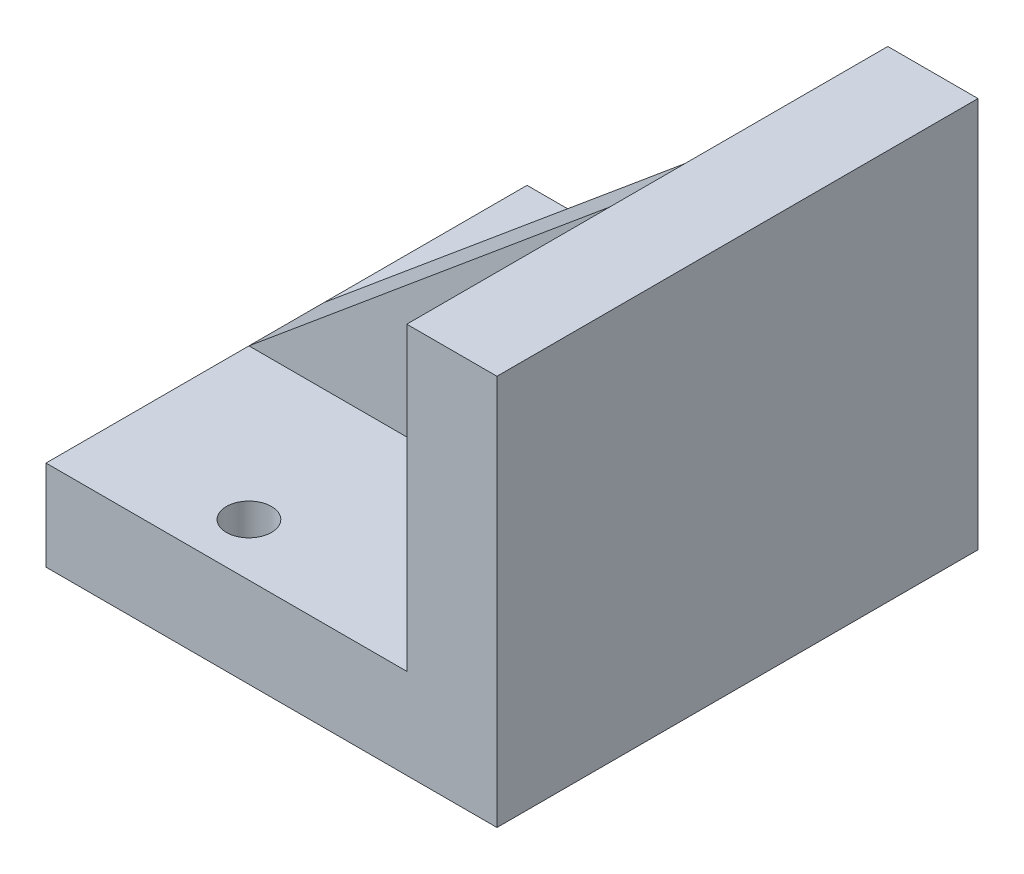
ISO-10303-21;
HEADER;
FILE_DESCRIPTION(('STEP AP214'),'2;1');
FILE_NAME('part.step','',(''),(''),'','','');
FILE_SCHEMA(('AUTOMOTIVE_DESIGN { 1 0 10303 214 1 1 1 1 }'));
ENDSEC;
DATA;
#1=APPLICATION_CONTEXT('core data for automotive mechanical design processes');
#2=APPLICATION_PROTOCOL_DEFINITION('international standard','automotive_design',2000,#1);
#3=PRODUCT_CONTEXT('',#1,'mechanical');
#4=PRODUCT('Part','Part','',(#3));
#5=PRODUCT_RELATED_PRODUCT_CATEGORY('part','',(#4));
#6=PRODUCT_DEFINITION_FORMATION('','',#4);
#7=PRODUCT_DEFINITION_CONTEXT('part definition',#1,'design');
#8=PRODUCT_DEFINITION('design','',#6,#7);
#9=PRODUCT_DEFINITION_SHAPE('','',#8);
#10=(LENGTH_UNIT() NAMED_UNIT(*) SI_UNIT(.MILLI.,.METRE.));
#11=(NAMED_UNIT(*) PLANE_ANGLE_UNIT() SI_UNIT($,.RADIAN.));
#12=(NAMED_UNIT(*) SI_UNIT($,.STERADIAN.) SOLID_ANGLE_UNIT());
#13=UNCERTAINTY_MEASURE_WITH_UNIT(LENGTH_MEASURE(1.E-05),#10,'distance_accuracy_value','');
#14=(GEOMETRIC_REPRESENTATION_CONTEXT(3) GLOBAL_UNCERTAINTY_ASSIGNED_CONTEXT((#13)) GLOBAL_UNIT_ASSIGNED_CONTEXT((#10,
#11,#12)) REPRESENTATION_CONTEXT('',''));
#15=CARTESIAN_POINT('',(0.,0.,0.));
#16=DIRECTION('',(0.,0.,1.));
#17=DIRECTION('',(1.,0.,0.));
#18=AXIS2_PLACEMENT_3D('',#15,#16,#17);
#19=CARTESIAN_POINT('',(0.,6.,0.));
#20=DIRECTION('',(0.,-1.,0.));
#21=DIRECTION('',(0.,0.,-1.));
#22=AXIS2_PLACEMENT_3D('',#19,#20,#21);
#23=PLANE('',#22);
#24=CARTESIAN_POINT('',(-5.00000000000001,6.,-12.5));
#25=DIRECTION('',(0.,1.,0.));
#26=DIRECTION('',(0.,0.,1.));
#27=AXIS2_PLACEMENT_3D('',#24,#25,#26);
#28=CIRCLE('',#27,1.5);
#29=CARTESIAN_POINT('',(-5.00000000000001,6.,-11.));
#30=VERTEX_POINT('',#29);
#31=EDGE_CURVE('E173',#30,#30,#28,.T.);
#32=ORIENTED_EDGE('',*,*,#31,.F.);
#33=EDGE_LOOP('',(#32));
#34=FACE_BOUND('',#33,.T.);
#35=DIRECTION('',(-1.,0.,0.));
#36=VECTOR('',#35,1.);
#37=CARTESIAN_POINT('',(-15.,6.,-2.5));
#38=LINE('',#37,#36);
#39=CARTESIAN_POINT('',(9.,6.,-2.5));
#40=VERTEX_POINT('',#39);
#41=CARTESIAN_POINT('',(-15.,6.,-2.5));
#42=VERTEX_POINT('',#41);
#43=EDGE_CURVE('E201',#40,#42,#38,.T.);
#44=ORIENTED_EDGE('',*,*,#43,.F.);
#45=DIRECTION('',(0.,0.,1.));
#46=VECTOR('',#45,1.);
#47=CARTESIAN_POINT('',(9.,6.,-16.));
#48=LINE('',#47,#46);
#49=CARTESIAN_POINT('',(9.,6.,-16.));
#50=VERTEX_POINT('',#49);
#51=EDGE_CURVE('E50',#50,#40,#48,.T.);
#52=ORIENTED_EDGE('',*,*,#51,.F.);
#53=DIRECTION('',(-1.,0.,0.));
#54=VECTOR('',#53,1.);
#55=CARTESIAN_POINT('',(-15.,6.,-16.));
#56=LINE('',#55,#54);
#57=CARTESIAN_POINT('',(-15.,6.,-16.));
#58=VERTEX_POINT('',#57);
#59=EDGE_CURVE('E90',#50,#58,#56,.T.);
#60=ORIENTED_EDGE('',*,*,#59,.T.);
#61=DIRECTION('',(0.,0.,1.));
#62=VECTOR('',#61,1.);
#63=CARTESIAN_POINT('',(-15.,6.,16.));
#64=LINE('',#63,#62);
#65=EDGE_CURVE('E121',#58,#42,#64,.T.);
#66=ORIENTED_EDGE('',*,*,#65,.T.);
#67=EDGE_LOOP('',(#44,#52,#60,#66));
#68=FACE_BOUND('',#67,.T.);
#69=ADVANCED_FACE('F35',(#34,#68),#23,.F.);
#70=CARTESIAN_POINT('',(-5.,6.,12.5));
#71=DIRECTION('',(0.,1.,0.));
#72=DIRECTION('',(0.,0.,-1.));
#73=AXIS2_PLACEMENT_3D('',#70,#71,#72);
#74=CIRCLE('',#73,1.5);
#75=CARTESIAN_POINT('',(-5.,6.,11.));
#76=VERTEX_POINT('',#75);
#77=EDGE_CURVE('E186',#76,#76,#74,.T.);
#78=ORIENTED_EDGE('',*,*,#77,.F.);
#79=EDGE_LOOP('',(#78));
#80=FACE_BOUND('',#79,.T.);
#81=DIRECTION('',(1.,0.,0.));
#82=VECTOR('',#81,1.);
#83=CARTESIAN_POINT('',(-15.,6.,2.5));
#84=LINE('',#83,#82);
#85=CARTESIAN_POINT('',(-15.,6.,2.5));
#86=VERTEX_POINT('',#85);
#87=CARTESIAN_POINT('',(9.,6.,2.5));
#88=VERTEX_POINT('',#87);
#89=EDGE_CURVE('E170',#86,#88,#84,.T.);
#90=ORIENTED_EDGE('',*,*,#89,.F.);
#91=CARTESIAN_POINT('',(-15.,6.,16.));
#92=VERTEX_POINT('',#91);
#93=EDGE_CURVE('E59',#86,#92,#64,.T.);
#94=ORIENTED_EDGE('',*,*,#93,.T.);
#95=DIRECTION('',(1.,0.,0.));
#96=VECTOR('',#95,1.);
#97=CARTESIAN_POINT('',(-15.,6.,16.));
#98=LINE('',#97,#96);
#99=CARTESIAN_POINT('',(9.,6.,16.));
#100=VERTEX_POINT('',#99);
#101=EDGE_CURVE('E100',#92,#100,#98,.T.);
#102=ORIENTED_EDGE('',*,*,#101,.T.);
#103=EDGE_CURVE('E160',#88,#100,#48,.T.);
#104=ORIENTED_EDGE('',*,*,#103,.F.);
#105=EDGE_LOOP('',(#90,#94,#102,#104));
#106=FACE_BOUND('',#105,.T.);
#107=ADVANCED_FACE('F167',(#80,#106),#23,.F.);
#108=CARTESIAN_POINT('',(9.,26.,-16.));
#109=DIRECTION('',(1.,0.,0.));
#110=DIRECTION('',(0.,0.,-1.));
#111=AXIS2_PLACEMENT_3D('',#108,#109,#110);
#112=PLANE('',#111);
#113=DIRECTION('',(0.,-1.,0.));
#114=VECTOR('',#113,1.);
#115=CARTESIAN_POINT('',(9.,26.,-2.5));
#116=LINE('',#115,#114);
#117=CARTESIAN_POINT('',(9.,26.,-2.5));
#118=VERTEX_POINT('',#117);
#119=EDGE_CURVE('E181',#118,#40,#116,.T.);
#120=ORIENTED_EDGE('',*,*,#119,.F.);
#121=DIRECTION('',(0.,0.,1.));
#122=VECTOR('',#121,1.);
#123=CARTESIAN_POINT('',(9.,26.,-16.));
#124=LINE('',#123,#122);
#125=CARTESIAN_POINT('',(9.,26.,-16.));
#126=VERTEX_POINT('',#125);
#127=EDGE_CURVE('E155',#126,#118,#124,.T.);
#128=ORIENTED_EDGE('',*,*,#127,.F.);
#129=DIRECTION('',(0.,-1.,0.));
#130=VECTOR('',#129,1.);
#131=CARTESIAN_POINT('',(9.,26.,-16.));
#132=LINE('',#131,#130);
#133=EDGE_CURVE('E104',#126,#50,#132,.T.);
#134=ORIENTED_EDGE('',*,*,#133,.T.);
#135=ORIENTED_EDGE('',*,*,#51,.T.);
#136=EDGE_LOOP('',(#120,#128,#134,#135));
#137=FACE_BOUND('',#136,.T.);
#138=ADVANCED_FACE('F193',(#137),#112,.F.);
#139=DIRECTION('',(0.,-1.,0.));
#140=VECTOR('',#139,1.);
#141=CARTESIAN_POINT('',(9.,26.,2.5));
#142=LINE('',#141,#140);
#143=CARTESIAN_POINT('',(9.,26.,2.5));
#144=VERTEX_POINT('',#143);
#145=EDGE_CURVE('E200',#144,#88,#142,.T.);
#146=ORIENTED_EDGE('',*,*,#145,.T.);
#147=ORIENTED_EDGE('',*,*,#103,.T.);
#148=DIRECTION('',(0.,-1.,0.));
#149=VECTOR('',#148,1.);
#150=CARTESIAN_POINT('',(9.,26.,16.));
#151=LINE('',#150,#149);
#152=CARTESIAN_POINT('',(9.,26.,16.));
#153=VERTEX_POINT('',#152);
#154=EDGE_CURVE('E108',#153,#100,#151,.T.);
#155=ORIENTED_EDGE('',*,*,#154,.F.);
#156=EDGE_CURVE('E144',#144,#153,#124,.T.);
#157=ORIENTED_EDGE('',*,*,#156,.F.);
#158=EDGE_LOOP('',(#146,#147,#155,#157));
#159=FACE_BOUND('',#158,.T.);
#160=ADVANCED_FACE('F158',(#159),#112,.F.);
#161=CARTESIAN_POINT('',(15.,6.,16.));
#162=DIRECTION('',(-1.,0.,0.));
#163=DIRECTION('',(0.,0.,1.));
#164=AXIS2_PLACEMENT_3D('',#161,#162,#163);
#165=PLANE('',#164);
#166=DIRECTION('',(0.,0.,-1.));
#167=VECTOR('',#166,1.);
#168=CARTESIAN_POINT('',(15.,0.,16.));
#169=LINE('',#168,#167);
#170=CARTESIAN_POINT('',(15.,0.,16.));
#171=VERTEX_POINT('',#170);
#172=CARTESIAN_POINT('',(15.,0.,-16.));
#173=VERTEX_POINT('',#172);
#174=EDGE_CURVE('E97',#171,#173,#169,.T.);
#175=ORIENTED_EDGE('',*,*,#174,.T.);
#176=DIRECTION('',(0.,-1.,0.));
#177=VECTOR('',#176,1.);
#178=CARTESIAN_POINT('',(15.,6.,-16.));
#179=LINE('',#178,#177);
#180=CARTESIAN_POINT('',(15.,26.,-16.));
#181=VERTEX_POINT('',#180);
#182=EDGE_CURVE('E11',#181,#173,#179,.T.);
#183=ORIENTED_EDGE('',*,*,#182,.F.);
#184=DIRECTION('',(0.,0.,-1.));
#185=VECTOR('',#184,1.);
#186=CARTESIAN_POINT('',(15.,26.,-16.));
#187=LINE('',#186,#185);
#188=CARTESIAN_POINT('',(15.,26.,16.));
#189=VERTEX_POINT('',#188);
#190=EDGE_CURVE('E99',#189,#181,#187,.T.);
#191=ORIENTED_EDGE('',*,*,#190,.F.);
#192=DIRECTION('',(0.,-1.,0.));
#193=VECTOR('',#192,1.);
#194=CARTESIAN_POINT('',(15.,6.,16.));
#195=LINE('',#194,#193);
#196=EDGE_CURVE('E83',#189,#171,#195,.T.);
#197=ORIENTED_EDGE('',*,*,#196,.T.);
#198=EDGE_LOOP('',(#175,#183,#191,#197));
#199=FACE_BOUND('',#198,.T.);
#200=ADVANCED_FACE('F37',(#199),#165,.F.);
#201=CARTESIAN_POINT('',(-15.,6.,-16.));
#202=DIRECTION('',(0.,0.,1.));
#203=DIRECTION('',(1.,0.,0.));
#204=AXIS2_PLACEMENT_3D('',#201,#202,#203);
#205=PLANE('',#204);
#206=DIRECTION('',(-1.,0.,0.));
#207=VECTOR('',#206,1.);
#208=CARTESIAN_POINT('',(-15.,0.,-16.));
#209=LINE('',#208,#207);
#210=CARTESIAN_POINT('',(-15.,0.,-16.));
#211=VERTEX_POINT('',#210);
#212=EDGE_CURVE('E103',#173,#211,#209,.T.);
#213=ORIENTED_EDGE('',*,*,#212,.T.);
#214=DIRECTION('',(0.,-1.,0.));
#215=VECTOR('',#214,1.);
#216=CARTESIAN_POINT('',(-15.,6.,-16.));
#217=LINE('',#216,#215);
#218=EDGE_CURVE('E43',#58,#211,#217,.T.);
#219=ORIENTED_EDGE('',*,*,#218,.F.);
#220=ORIENTED_EDGE('',*,*,#59,.F.);
#221=ORIENTED_EDGE('',*,*,#133,.F.);
#222=DIRECTION('',(-1.,0.,0.));
#223=VECTOR('',#222,1.);
#224=CARTESIAN_POINT('',(15.,26.,-16.));
#225=LINE('',#224,#223);
#226=EDGE_CURVE('E128',#181,#126,#225,.T.);
#227=ORIENTED_EDGE('',*,*,#226,.F.);
#228=ORIENTED_EDGE('',*,*,#182,.T.);
#229=EDGE_LOOP('',(#213,#219,#220,#221,#227,#228));
#230=FACE_BOUND('',#229,.T.);
#231=ADVANCED_FACE('F123',(#230),#205,.F.);
#232=CARTESIAN_POINT('',(-15.,6.,16.));
#233=DIRECTION('',(1.,0.,0.));
#234=DIRECTION('',(0.,0.,-1.));
#235=AXIS2_PLACEMENT_3D('',#232,#233,#234);
#236=PLANE('',#235);
#237=ORIENTED_EDGE('',*,*,#93,.F.);
#238=DIRECTION('',(0.,0.,1.));
#239=VECTOR('',#238,1.);
#240=CARTESIAN_POINT('',(-15.,6.,-16.));
#241=LINE('',#240,#239);
#242=EDGE_CURVE('E207',#42,#86,#241,.T.);
#243=ORIENTED_EDGE('',*,*,#242,.F.);
#244=ORIENTED_EDGE('',*,*,#65,.F.);
#245=ORIENTED_EDGE('',*,*,#218,.T.);
#246=DIRECTION('',(0.,0.,1.));
#247=VECTOR('',#246,1.);
#248=CARTESIAN_POINT('',(-15.,0.,16.));
#249=LINE('',#248,#247);
#250=CARTESIAN_POINT('',(-15.,0.,16.));
#251=VERTEX_POINT('',#250);
#252=EDGE_CURVE('E91',#211,#251,#249,.T.);
#253=ORIENTED_EDGE('',*,*,#252,.T.);
#254=DIRECTION('',(0.,-1.,0.));
#255=VECTOR('',#254,1.);
#256=CARTESIAN_POINT('',(-15.,6.,16.));
#257=LINE('',#256,#255);
#258=EDGE_CURVE('E86',#92,#251,#257,.T.);
#259=ORIENTED_EDGE('',*,*,#258,.F.);
#260=EDGE_LOOP('',(#237,#243,#244,#245,#253,#259));
#261=FACE_BOUND('',#260,.T.);
#262=ADVANCED_FACE('F118',(#261),#236,.F.);
#263=CARTESIAN_POINT('',(-15.,6.,16.));
#264=DIRECTION('',(0.,0.,-1.));
#265=DIRECTION('',(-1.,0.,0.));
#266=AXIS2_PLACEMENT_3D('',#263,#264,#265);
#267=PLANE('',#266);
#268=DIRECTION('',(1.,0.,0.));
#269=VECTOR('',#268,1.);
#270=CARTESIAN_POINT('',(-15.,0.,16.));
#271=LINE('',#270,#269);
#272=EDGE_CURVE('E79',#251,#171,#271,.T.);
#273=ORIENTED_EDGE('',*,*,#272,.T.);
#274=ORIENTED_EDGE('',*,*,#196,.F.);
#275=DIRECTION('',(1.,0.,0.));
#276=VECTOR('',#275,1.);
#277=CARTESIAN_POINT('',(15.,26.,16.));
#278=LINE('',#277,#276);
#279=EDGE_CURVE('E148',#153,#189,#278,.T.);
#280=ORIENTED_EDGE('',*,*,#279,.F.);
#281=ORIENTED_EDGE('',*,*,#154,.T.);
#282=ORIENTED_EDGE('',*,*,#101,.F.);
#283=ORIENTED_EDGE('',*,*,#258,.T.);
#284=EDGE_LOOP('',(#273,#274,#280,#281,#282,#283));
#285=FACE_BOUND('',#284,.T.);
#286=ADVANCED_FACE('F81',(#285),#267,.F.);
#287=CARTESIAN_POINT('',(0.,0.,0.));
#288=DIRECTION('',(0.,-1.,0.));
#289=DIRECTION('',(0.,0.,-1.));
#290=AXIS2_PLACEMENT_3D('',#287,#288,#289);
#291=PLANE('',#290);
#292=CARTESIAN_POINT('',(-5.00000000000001,0.,-12.5));
#293=DIRECTION('',(0.,1.,0.));
#294=DIRECTION('',(0.,0.,1.));
#295=AXIS2_PLACEMENT_3D('',#292,#293,#294);
#296=CIRCLE('',#295,1.5);
#297=CARTESIAN_POINT('',(-5.00000000000001,0.,-11.));
#298=VERTEX_POINT('',#297);
#299=EDGE_CURVE('E171',#298,#298,#296,.T.);
#300=ORIENTED_EDGE('',*,*,#299,.T.);
#301=EDGE_LOOP('',(#300));
#302=FACE_BOUND('',#301,.T.);
#303=CARTESIAN_POINT('',(-5.,0.,12.5));
#304=DIRECTION('',(0.,1.,0.));
#305=DIRECTION('',(0.,0.,-1.));
#306=AXIS2_PLACEMENT_3D('',#303,#304,#305);
#307=CIRCLE('',#306,1.5);
#308=CARTESIAN_POINT('',(-5.,0.,11.));
#309=VERTEX_POINT('',#308);
#310=EDGE_CURVE('E178',#309,#309,#307,.T.);
#311=ORIENTED_EDGE('',*,*,#310,.T.);
#312=EDGE_LOOP('',(#311));
#313=FACE_BOUND('',#312,.T.);
#314=ORIENTED_EDGE('',*,*,#174,.F.);
#315=ORIENTED_EDGE('',*,*,#272,.F.);
#316=ORIENTED_EDGE('',*,*,#252,.F.);
#317=ORIENTED_EDGE('',*,*,#212,.F.);
#318=EDGE_LOOP('',(#314,#315,#316,#317));
#319=FACE_BOUND('',#318,.T.);
#320=ADVANCED_FACE('F102',(#302,#313,#319),#291,.T.);
#321=CARTESIAN_POINT('',(0.,26.,0.));
#322=DIRECTION('',(0.,-1.,0.));
#323=DIRECTION('',(0.,0.,-1.));
#324=AXIS2_PLACEMENT_3D('',#321,#322,#323);
#325=PLANE('',#324);
#326=ORIENTED_EDGE('',*,*,#127,.T.);
#327=DIRECTION('',(0.,0.,1.));
#328=VECTOR('',#327,1.);
#329=CARTESIAN_POINT('',(9.,26.,-16.));
#330=LINE('',#329,#328);
#331=EDGE_CURVE('E151',#118,#144,#330,.T.);
#332=ORIENTED_EDGE('',*,*,#331,.T.);
#333=ORIENTED_EDGE('',*,*,#156,.T.);
#334=ORIENTED_EDGE('',*,*,#279,.T.);
#335=ORIENTED_EDGE('',*,*,#190,.T.);
#336=ORIENTED_EDGE('',*,*,#226,.T.);
#337=EDGE_LOOP('',(#326,#332,#333,#334,#335,#336));
#338=FACE_BOUND('',#337,.T.);
#339=ADVANCED_FACE('F147',(#338),#325,.F.);
#340=CARTESIAN_POINT('',(-5.,0.,12.5));
#341=DIRECTION('',(0.,1.,0.));
#342=DIRECTION('',(0.,0.,1.));
#343=AXIS2_PLACEMENT_3D('',#340,#341,#342);
#344=CYLINDRICAL_SURFACE('',#343,1.5);
#345=ORIENTED_EDGE('',*,*,#310,.F.);
#346=EDGE_LOOP('',(#345));
#347=FACE_BOUND('',#346,.T.);
#348=ORIENTED_EDGE('',*,*,#77,.T.);
#349=EDGE_LOOP('',(#348));
#350=FACE_BOUND('',#349,.T.);
#351=ADVANCED_FACE('F270',(#347,#350),#344,.F.);
#352=CARTESIAN_POINT('',(-5.00000000000001,0.,-12.5));
#353=DIRECTION('',(0.,1.,0.));
#354=DIRECTION('',(0.,0.,1.));
#355=AXIS2_PLACEMENT_3D('',#352,#353,#354);
#356=CYLINDRICAL_SURFACE('',#355,1.5);
#357=ORIENTED_EDGE('',*,*,#299,.F.);
#358=EDGE_LOOP('',(#357));
#359=FACE_BOUND('',#358,.T.);
#360=ORIENTED_EDGE('',*,*,#31,.T.);
#361=EDGE_LOOP('',(#360));
#362=FACE_BOUND('',#361,.T.);
#363=ADVANCED_FACE('F265',(#359,#362),#356,.F.);
#364=CARTESIAN_POINT('',(-15.,26.,-2.5));
#365=DIRECTION('',(0.,0.,1.));
#366=DIRECTION('',(1.,0.,0.));
#367=AXIS2_PLACEMENT_3D('',#364,#365,#366);
#368=PLANE('',#367);
#369=ORIENTED_EDGE('',*,*,#43,.T.);
#370=DIRECTION('',(0.768221279597376,0.64018439966448,0.));
#371=VECTOR('',#370,1.);
#372=CARTESIAN_POINT('',(-5.16393442622951,14.1967213114754,-2.5));
#373=LINE('',#372,#371);
#374=EDGE_CURVE('E205',#42,#118,#373,.T.);
#375=ORIENTED_EDGE('',*,*,#374,.T.);
#376=ORIENTED_EDGE('',*,*,#119,.T.);
#377=EDGE_LOOP('',(#369,#375,#376));
#378=FACE_BOUND('',#377,.T.);
#379=ADVANCED_FACE('F222',(#378),#368,.F.);
#380=CARTESIAN_POINT('',(-15.,26.,2.5));
#381=DIRECTION('',(0.,0.,-1.));
#382=DIRECTION('',(-1.,0.,0.));
#383=AXIS2_PLACEMENT_3D('',#380,#381,#382);
#384=PLANE('',#383);
#385=ORIENTED_EDGE('',*,*,#145,.F.);
#386=DIRECTION('',(0.768221279597376,0.64018439966448,0.));
#387=VECTOR('',#386,1.);
#388=CARTESIAN_POINT('',(9.,26.,2.5));
#389=LINE('',#388,#387);
#390=EDGE_CURVE('E209',#86,#144,#389,.T.);
#391=ORIENTED_EDGE('',*,*,#390,.F.);
#392=ORIENTED_EDGE('',*,*,#89,.T.);
#393=EDGE_LOOP('',(#385,#391,#392));
#394=FACE_BOUND('',#393,.T.);
#395=ADVANCED_FACE('F219',(#394),#384,.F.);
#396=CARTESIAN_POINT('',(9.,26.,-16.));
#397=DIRECTION('',(0.64018439966448,-0.768221279597376,0.));
#398=DIRECTION('',(0.768221279597376,0.64018439966448,0.));
#399=AXIS2_PLACEMENT_3D('',#396,#397,#398);
#400=PLANE('',#399);
#401=ORIENTED_EDGE('',*,*,#242,.T.);
#402=ORIENTED_EDGE('',*,*,#390,.T.);
#403=ORIENTED_EDGE('',*,*,#331,.F.);
#404=ORIENTED_EDGE('',*,*,#374,.F.);
#405=EDGE_LOOP('',(#401,#402,#403,#404));
#406=FACE_BOUND('',#405,.T.);
#407=ADVANCED_FACE('F215',(#406),#400,.F.);
#408=CLOSED_SHELL('',(#69,#107,#138,#160,#200,#231,#262,#286,#320,#339,#351,#363,#379,#395,#407));
#409=MANIFOLD_SOLID_BREP('B2',#408);
#410=ADVANCED_BREP_SHAPE_REPRESENTATION('',(#18,#409),#14);
#411=SHAPE_DEFINITION_REPRESENTATION(#9,#410);
ENDSEC;
END-ISO-10303-21;
